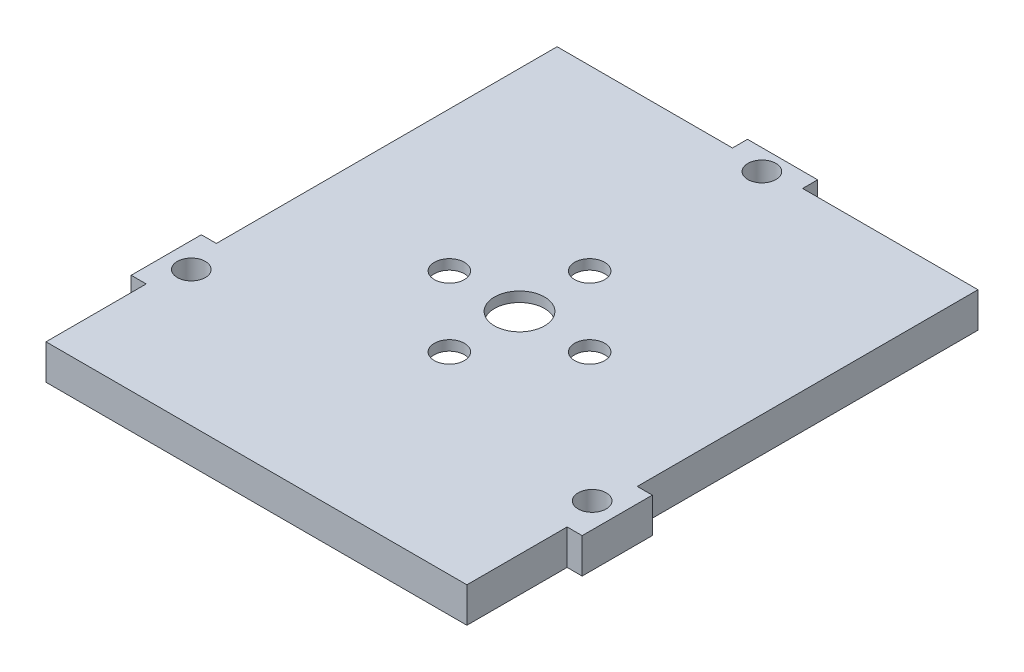
ISO-10303-21;
HEADER;
FILE_DESCRIPTION(('STEP AP214'),'2;1');
FILE_NAME('part.step','',(''),(''),'','','');
FILE_SCHEMA(('AUTOMOTIVE_DESIGN { 1 0 10303 214 1 1 1 1 }'));
ENDSEC;
DATA;
#1=APPLICATION_CONTEXT('core data for automotive mechanical design processes');
#2=APPLICATION_PROTOCOL_DEFINITION('international standard','automotive_design',2000,#1);
#3=PRODUCT_CONTEXT('',#1,'mechanical');
#4=PRODUCT('Part','Part','',(#3));
#5=PRODUCT_RELATED_PRODUCT_CATEGORY('part','',(#4));
#6=PRODUCT_DEFINITION_FORMATION('','',#4);
#7=PRODUCT_DEFINITION_CONTEXT('part definition',#1,'design');
#8=PRODUCT_DEFINITION('design','',#6,#7);
#9=PRODUCT_DEFINITION_SHAPE('','',#8);
#10=(LENGTH_UNIT() NAMED_UNIT(*) SI_UNIT(.MILLI.,.METRE.));
#11=(NAMED_UNIT(*) PLANE_ANGLE_UNIT() SI_UNIT($,.RADIAN.));
#12=(NAMED_UNIT(*) SI_UNIT($,.STERADIAN.) SOLID_ANGLE_UNIT());
#13=UNCERTAINTY_MEASURE_WITH_UNIT(LENGTH_MEASURE(1.E-05),#10,'distance_accuracy_value','');
#14=(GEOMETRIC_REPRESENTATION_CONTEXT(3) GLOBAL_UNCERTAINTY_ASSIGNED_CONTEXT((#13)) GLOBAL_UNIT_ASSIGNED_CONTEXT((#10,
#11,#12)) REPRESENTATION_CONTEXT('',''));
#15=CARTESIAN_POINT('',(0.,0.,0.));
#16=DIRECTION('',(0.,0.,1.));
#17=DIRECTION('',(1.,0.,0.));
#18=AXIS2_PLACEMENT_3D('',#15,#16,#17);
#19=CARTESIAN_POINT('',(0.,1.,-0.750000000000001));
#20=DIRECTION('',(0.,1.,0.));
#21=DIRECTION('',(0.,0.,1.));
#22=AXIS2_PLACEMENT_3D('',#19,#20,#21);
#23=CYLINDRICAL_SURFACE('',#22,2.5);
#24=CARTESIAN_POINT('',(0.,3.5,-0.750000000000001));
#25=DIRECTION('',(0.,1.,0.));
#26=DIRECTION('',(0.,0.,1.));
#27=AXIS2_PLACEMENT_3D('',#24,#25,#26);
#28=CIRCLE('',#27,2.5);
#29=CARTESIAN_POINT('',(0.,3.5,1.75));
#30=VERTEX_POINT('',#29);
#31=EDGE_CURVE('E241',#30,#30,#28,.T.);
#32=ORIENTED_EDGE('',*,*,#31,.T.);
#33=EDGE_LOOP('',(#32));
#34=FACE_BOUND('',#33,.T.);
#35=CARTESIAN_POINT('',(0.,2.5,-0.750000000000001));
#36=DIRECTION('',(0.,-1.,0.));
#37=DIRECTION('',(0.,0.,-1.));
#38=AXIS2_PLACEMENT_3D('',#35,#36,#37);
#39=CIRCLE('',#38,2.5);
#40=CARTESIAN_POINT('',(0.,2.5,-3.25));
#41=VERTEX_POINT('',#40);
#42=EDGE_CURVE('E228',#41,#41,#39,.F.);
#43=ORIENTED_EDGE('',*,*,#42,.F.);
#44=EDGE_LOOP('',(#43));
#45=FACE_BOUND('',#44,.T.);
#46=ADVANCED_FACE('F41',(#34,#45),#23,.F.);
#47=CARTESIAN_POINT('',(0.,1.,6.25));
#48=DIRECTION('',(0.,1.,0.));
#49=DIRECTION('',(0.,0.,1.));
#50=AXIS2_PLACEMENT_3D('',#47,#48,#49);
#51=CYLINDRICAL_SURFACE('',#50,1.5);
#52=CARTESIAN_POINT('',(0.,3.5,6.25));
#53=DIRECTION('',(0.,1.,0.));
#54=DIRECTION('',(0.,0.,-1.));
#55=AXIS2_PLACEMENT_3D('',#52,#53,#54);
#56=CIRCLE('',#55,1.5);
#57=CARTESIAN_POINT('',(0.,3.5,4.75));
#58=VERTEX_POINT('',#57);
#59=EDGE_CURVE('E231',#58,#58,#56,.T.);
#60=ORIENTED_EDGE('',*,*,#59,.T.);
#61=EDGE_LOOP('',(#60));
#62=FACE_BOUND('',#61,.T.);
#63=CARTESIAN_POINT('',(0.,2.5,6.25));
#64=DIRECTION('',(0.,-1.,0.));
#65=DIRECTION('',(0.,0.,-1.));
#66=AXIS2_PLACEMENT_3D('',#63,#64,#65);
#67=CIRCLE('',#66,1.5);
#68=CARTESIAN_POINT('',(0.,2.5,4.75));
#69=VERTEX_POINT('',#68);
#70=EDGE_CURVE('E225',#69,#69,#67,.F.);
#71=ORIENTED_EDGE('',*,*,#70,.F.);
#72=EDGE_LOOP('',(#71));
#73=FACE_BOUND('',#72,.T.);
#74=ADVANCED_FACE('F396',(#62,#73),#51,.F.);
#75=CARTESIAN_POINT('',(7.,1.,-0.750000000000004));
#76=DIRECTION('',(0.,1.,0.));
#77=DIRECTION('',(0.,0.,1.));
#78=AXIS2_PLACEMENT_3D('',#75,#76,#77);
#79=CYLINDRICAL_SURFACE('',#78,1.5);
#80=CARTESIAN_POINT('',(7.,3.5,-0.750000000000004));
#81=DIRECTION('',(0.,1.,0.));
#82=DIRECTION('',(0.,0.,-1.));
#83=AXIS2_PLACEMENT_3D('',#80,#81,#82);
#84=CIRCLE('',#83,1.5);
#85=CARTESIAN_POINT('',(7.,3.5,-2.25));
#86=VERTEX_POINT('',#85);
#87=EDGE_CURVE('E232',#86,#86,#84,.T.);
#88=ORIENTED_EDGE('',*,*,#87,.T.);
#89=EDGE_LOOP('',(#88));
#90=FACE_BOUND('',#89,.T.);
#91=CARTESIAN_POINT('',(7.,2.5,-0.750000000000004));
#92=DIRECTION('',(0.,-1.,0.));
#93=DIRECTION('',(0.,0.,-1.));
#94=AXIS2_PLACEMENT_3D('',#91,#92,#93);
#95=CIRCLE('',#94,1.5);
#96=CARTESIAN_POINT('',(7.,2.5,-2.25));
#97=VERTEX_POINT('',#96);
#98=EDGE_CURVE('E222',#97,#97,#95,.F.);
#99=ORIENTED_EDGE('',*,*,#98,.F.);
#100=EDGE_LOOP('',(#99));
#101=FACE_BOUND('',#100,.T.);
#102=ADVANCED_FACE('F401',(#90,#101),#79,.F.);
#103=CARTESIAN_POINT('',(0.,1.,-7.75));
#104=DIRECTION('',(0.,1.,0.));
#105=DIRECTION('',(0.,0.,1.));
#106=AXIS2_PLACEMENT_3D('',#103,#104,#105);
#107=CYLINDRICAL_SURFACE('',#106,1.5);
#108=CARTESIAN_POINT('',(0.,3.5,-7.75));
#109=DIRECTION('',(0.,1.,0.));
#110=DIRECTION('',(0.,0.,1.));
#111=AXIS2_PLACEMENT_3D('',#108,#109,#110);
#112=CIRCLE('',#111,1.5);
#113=CARTESIAN_POINT('',(0.,3.5,-6.25));
#114=VERTEX_POINT('',#113);
#115=EDGE_CURVE('E235',#114,#114,#112,.T.);
#116=ORIENTED_EDGE('',*,*,#115,.T.);
#117=EDGE_LOOP('',(#116));
#118=FACE_BOUND('',#117,.T.);
#119=CARTESIAN_POINT('',(0.,2.5,-7.75));
#120=DIRECTION('',(0.,-1.,0.));
#121=DIRECTION('',(0.,0.,-1.));
#122=AXIS2_PLACEMENT_3D('',#119,#120,#121);
#123=CIRCLE('',#122,1.5);
#124=CARTESIAN_POINT('',(0.,2.5,-9.25));
#125=VERTEX_POINT('',#124);
#126=EDGE_CURVE('E219',#125,#125,#123,.F.);
#127=ORIENTED_EDGE('',*,*,#126,.F.);
#128=EDGE_LOOP('',(#127));
#129=FACE_BOUND('',#128,.T.);
#130=ADVANCED_FACE('F406',(#118,#129),#107,.F.);
#131=CARTESIAN_POINT('',(-7.,1.,-0.750000000000002));
#132=DIRECTION('',(0.,1.,0.));
#133=DIRECTION('',(0.,0.,1.));
#134=AXIS2_PLACEMENT_3D('',#131,#132,#133);
#135=CYLINDRICAL_SURFACE('',#134,1.5);
#136=CARTESIAN_POINT('',(-7.,3.5,-0.750000000000002));
#137=DIRECTION('',(0.,1.,0.));
#138=DIRECTION('',(0.,0.,1.));
#139=AXIS2_PLACEMENT_3D('',#136,#137,#138);
#140=CIRCLE('',#139,1.5);
#141=CARTESIAN_POINT('',(-7.,3.5,0.749999999999997));
#142=VERTEX_POINT('',#141);
#143=EDGE_CURVE('E238',#142,#142,#140,.T.);
#144=ORIENTED_EDGE('',*,*,#143,.T.);
#145=EDGE_LOOP('',(#144));
#146=FACE_BOUND('',#145,.T.);
#147=CARTESIAN_POINT('',(-7.,2.5,-0.750000000000002));
#148=DIRECTION('',(0.,-1.,0.));
#149=DIRECTION('',(0.,0.,-1.));
#150=AXIS2_PLACEMENT_3D('',#147,#148,#149);
#151=CIRCLE('',#150,1.5);
#152=CARTESIAN_POINT('',(-7.,2.5,-2.25));
#153=VERTEX_POINT('',#152);
#154=EDGE_CURVE('E45',#153,#153,#151,.F.);
#155=ORIENTED_EDGE('',*,*,#154,.F.);
#156=EDGE_LOOP('',(#155));
#157=FACE_BOUND('',#156,.T.);
#158=ADVANCED_FACE('F409',(#146,#157),#135,.F.);
#159=CARTESIAN_POINT('',(0.,3.5,0.));
#160=DIRECTION('',(0.,1.,0.));
#161=DIRECTION('',(0.,0.,1.));
#162=AXIS2_PLACEMENT_3D('',#159,#160,#161);
#163=PLANE('',#162);
#164=ORIENTED_EDGE('',*,*,#143,.F.);
#165=EDGE_LOOP('',(#164));
#166=FACE_BOUND('',#165,.T.);
#167=ORIENTED_EDGE('',*,*,#115,.F.);
#168=EDGE_LOOP('',(#167));
#169=FACE_BOUND('',#168,.T.);
#170=ORIENTED_EDGE('',*,*,#87,.F.);
#171=EDGE_LOOP('',(#170));
#172=FACE_BOUND('',#171,.T.);
#173=ORIENTED_EDGE('',*,*,#59,.F.);
#174=EDGE_LOOP('',(#173));
#175=FACE_BOUND('',#174,.T.);
#176=ORIENTED_EDGE('',*,*,#31,.F.);
#177=EDGE_LOOP('',(#176));
#178=FACE_BOUND('',#177,.T.);
#179=CARTESIAN_POINT('',(-20.,3.5,12.));
#180=DIRECTION('',(0.,1.,0.));
#181=DIRECTION('',(0.,0.,1.));
#182=AXIS2_PLACEMENT_3D('',#179,#180,#181);
#183=CIRCLE('',#182,1.4);
#184=CARTESIAN_POINT('',(-20.,3.5,13.4));
#185=VERTEX_POINT('',#184);
#186=EDGE_CURVE('E247',#185,#185,#183,.T.);
#187=ORIENTED_EDGE('',*,*,#186,.F.);
#188=EDGE_LOOP('',(#187));
#189=FACE_BOUND('',#188,.T.);
#190=DIRECTION('',(0.,0.,1.));
#191=VECTOR('',#190,1.);
#192=CARTESIAN_POINT('',(21.,3.5,0.));
#193=LINE('',#192,#191);
#194=CARTESIAN_POINT('',(21.,3.5,-25.5));
#195=VERTEX_POINT('',#194);
#196=CARTESIAN_POINT('',(21.,3.5,8.5));
#197=VERTEX_POINT('',#196);
#198=EDGE_CURVE('E337',#195,#197,#193,.T.);
#199=ORIENTED_EDGE('',*,*,#198,.F.);
#200=DIRECTION('',(1.,0.,0.));
#201=VECTOR('',#200,1.);
#202=CARTESIAN_POINT('',(0.,3.5,-25.5));
#203=LINE('',#202,#201);
#204=CARTESIAN_POINT('',(3.5,3.5,-25.5));
#205=VERTEX_POINT('',#204);
#206=EDGE_CURVE('E339',#205,#195,#203,.T.);
#207=ORIENTED_EDGE('',*,*,#206,.F.);
#208=DIRECTION('',(0.,0.,1.));
#209=VECTOR('',#208,1.);
#210=CARTESIAN_POINT('',(3.5,3.5,-27.));
#211=LINE('',#210,#209);
#212=CARTESIAN_POINT('',(3.5,3.5,-27.));
#213=VERTEX_POINT('',#212);
#214=EDGE_CURVE('E266',#213,#205,#211,.T.);
#215=ORIENTED_EDGE('',*,*,#214,.F.);
#216=DIRECTION('',(1.,0.,0.));
#217=VECTOR('',#216,1.);
#218=CARTESIAN_POINT('',(3.5,3.5,-27.));
#219=LINE('',#218,#217);
#220=CARTESIAN_POINT('',(-3.5,3.5,-27.));
#221=VERTEX_POINT('',#220);
#222=EDGE_CURVE('E264',#221,#213,#219,.T.);
#223=ORIENTED_EDGE('',*,*,#222,.F.);
#224=DIRECTION('',(0.,0.,1.));
#225=VECTOR('',#224,1.);
#226=CARTESIAN_POINT('',(-3.5,3.5,-27.));
#227=LINE('',#226,#225);
#228=CARTESIAN_POINT('',(-3.5,3.5,-25.5));
#229=VERTEX_POINT('',#228);
#230=EDGE_CURVE('E273',#221,#229,#227,.T.);
#231=ORIENTED_EDGE('',*,*,#230,.T.);
#232=CARTESIAN_POINT('',(-21.,3.5,-25.5));
#233=VERTEX_POINT('',#232);
#234=EDGE_CURVE('E341',#233,#229,#203,.T.);
#235=ORIENTED_EDGE('',*,*,#234,.F.);
#236=DIRECTION('',(0.,0.,1.));
#237=VECTOR('',#236,1.);
#238=CARTESIAN_POINT('',(-21.,3.5,0.));
#239=LINE('',#238,#237);
#240=CARTESIAN_POINT('',(-21.,3.5,8.5));
#241=VERTEX_POINT('',#240);
#242=EDGE_CURVE('E344',#233,#241,#239,.T.);
#243=ORIENTED_EDGE('',*,*,#242,.T.);
#244=DIRECTION('',(1.,0.,0.));
#245=VECTOR('',#244,1.);
#246=CARTESIAN_POINT('',(-22.5,3.5,8.5));
#247=LINE('',#246,#245);
#248=CARTESIAN_POINT('',(-22.5,3.5,8.5));
#249=VERTEX_POINT('',#248);
#250=EDGE_CURVE('E330',#249,#241,#247,.T.);
#251=ORIENTED_EDGE('',*,*,#250,.F.);
#252=DIRECTION('',(0.,0.,-1.));
#253=VECTOR('',#252,1.);
#254=CARTESIAN_POINT('',(-22.5,3.5,15.5));
#255=LINE('',#254,#253);
#256=CARTESIAN_POINT('',(-22.5,3.5,15.5));
#257=VERTEX_POINT('',#256);
#258=EDGE_CURVE('E313',#257,#249,#255,.T.);
#259=ORIENTED_EDGE('',*,*,#258,.F.);
#260=DIRECTION('',(1.,0.,0.));
#261=VECTOR('',#260,1.);
#262=CARTESIAN_POINT('',(-22.5,3.5,15.5));
#263=LINE('',#262,#261);
#264=CARTESIAN_POINT('',(-21.,3.5,15.5));
#265=VERTEX_POINT('',#264);
#266=EDGE_CURVE('E333',#257,#265,#263,.T.);
#267=ORIENTED_EDGE('',*,*,#266,.T.);
#268=CARTESIAN_POINT('',(-21.,3.5,25.5));
#269=VERTEX_POINT('',#268);
#270=EDGE_CURVE('E343',#265,#269,#239,.T.);
#271=ORIENTED_EDGE('',*,*,#270,.T.);
#272=DIRECTION('',(1.,0.,0.));
#273=VECTOR('',#272,1.);
#274=CARTESIAN_POINT('',(0.,3.5,25.5));
#275=LINE('',#274,#273);
#276=CARTESIAN_POINT('',(21.,3.5,25.5));
#277=VERTEX_POINT('',#276);
#278=EDGE_CURVE('E347',#269,#277,#275,.T.);
#279=ORIENTED_EDGE('',*,*,#278,.T.);
#280=CARTESIAN_POINT('',(21.,3.5,15.5));
#281=VERTEX_POINT('',#280);
#282=EDGE_CURVE('E340',#281,#277,#193,.T.);
#283=ORIENTED_EDGE('',*,*,#282,.F.);
#284=DIRECTION('',(-1.,0.,0.));
#285=VECTOR('',#284,1.);
#286=CARTESIAN_POINT('',(22.5,3.5,15.5));
#287=LINE('',#286,#285);
#288=CARTESIAN_POINT('',(22.5,3.5,15.5));
#289=VERTEX_POINT('',#288);
#290=EDGE_CURVE('E303',#289,#281,#287,.T.);
#291=ORIENTED_EDGE('',*,*,#290,.F.);
#292=DIRECTION('',(0.,0.,1.));
#293=VECTOR('',#292,1.);
#294=CARTESIAN_POINT('',(22.5,3.5,8.5));
#295=LINE('',#294,#293);
#296=CARTESIAN_POINT('',(22.5,3.5,8.5));
#297=VERTEX_POINT('',#296);
#298=EDGE_CURVE('E286',#297,#289,#295,.T.);
#299=ORIENTED_EDGE('',*,*,#298,.F.);
#300=DIRECTION('',(-1.,0.,0.));
#301=VECTOR('',#300,1.);
#302=CARTESIAN_POINT('',(22.5,3.5,8.5));
#303=LINE('',#302,#301);
#304=EDGE_CURVE('E306',#297,#197,#303,.T.);
#305=ORIENTED_EDGE('',*,*,#304,.T.);
#306=EDGE_LOOP('',(#199,#207,#215,#223,#231,#235,#243,#251,#259,#267,#271,#279,#283,#291,#299,#305));
#307=FACE_BOUND('',#306,.T.);
#308=CARTESIAN_POINT('',(0.,3.5,-24.9375));
#309=DIRECTION('',(0.,1.,0.));
#310=DIRECTION('',(0.,0.,1.));
#311=AXIS2_PLACEMENT_3D('',#308,#309,#310);
#312=CIRCLE('',#311,1.4);
#313=CARTESIAN_POINT('',(0.,3.5,-23.5375));
#314=VERTEX_POINT('',#313);
#315=EDGE_CURVE('E246',#314,#314,#312,.T.);
#316=ORIENTED_EDGE('',*,*,#315,.F.);
#317=EDGE_LOOP('',(#316));
#318=FACE_BOUND('',#317,.T.);
#319=CARTESIAN_POINT('',(20.,3.5,12.));
#320=DIRECTION('',(0.,1.,0.));
#321=DIRECTION('',(0.,0.,1.));
#322=AXIS2_PLACEMENT_3D('',#319,#320,#321);
#323=CIRCLE('',#322,1.4);
#324=CARTESIAN_POINT('',(20.,3.5,13.4));
#325=VERTEX_POINT('',#324);
#326=EDGE_CURVE('E251',#325,#325,#323,.F.);
#327=ORIENTED_EDGE('',*,*,#326,.T.);
#328=EDGE_LOOP('',(#327));
#329=FACE_BOUND('',#328,.T.);
#330=ADVANCED_FACE('F412',(#166,#169,#172,#175,#178,#189,#307,#318,#329),#163,.T.);
#331=CARTESIAN_POINT('',(0.,0.,0.));
#332=DIRECTION('',(0.,1.,0.));
#333=DIRECTION('',(0.,0.,1.));
#334=AXIS2_PLACEMENT_3D('',#331,#332,#333);
#335=PLANE('',#334);
#336=DIRECTION('',(1.,0.,0.));
#337=VECTOR('',#336,1.);
#338=CARTESIAN_POINT('',(-12.5,0.,-13.25));
#339=LINE('',#338,#337);
#340=CARTESIAN_POINT('',(-12.5,0.,-13.25));
#341=VERTEX_POINT('',#340);
#342=CARTESIAN_POINT('',(12.5,0.,-13.25));
#343=VERTEX_POINT('',#342);
#344=EDGE_CURVE('E210',#341,#343,#339,.T.);
#345=ORIENTED_EDGE('',*,*,#344,.F.);
#346=DIRECTION('',(0.,0.,-1.));
#347=VECTOR('',#346,1.);
#348=CARTESIAN_POINT('',(-12.5,0.,11.75));
#349=LINE('',#348,#347);
#350=CARTESIAN_POINT('',(-12.5,0.,11.75));
#351=VERTEX_POINT('',#350);
#352=EDGE_CURVE('E58',#351,#341,#349,.T.);
#353=ORIENTED_EDGE('',*,*,#352,.F.);
#354=DIRECTION('',(-1.,0.,0.));
#355=VECTOR('',#354,1.);
#356=CARTESIAN_POINT('',(-12.5,0.,11.75));
#357=LINE('',#356,#355);
#358=CARTESIAN_POINT('',(12.5,0.,11.75));
#359=VERTEX_POINT('',#358);
#360=EDGE_CURVE('E201',#359,#351,#357,.T.);
#361=ORIENTED_EDGE('',*,*,#360,.F.);
#362=DIRECTION('',(0.,0.,1.));
#363=VECTOR('',#362,1.);
#364=CARTESIAN_POINT('',(12.5,0.,11.75));
#365=LINE('',#364,#363);
#366=EDGE_CURVE('E204',#343,#359,#365,.T.);
#367=ORIENTED_EDGE('',*,*,#366,.F.);
#368=EDGE_LOOP('',(#345,#353,#361,#367));
#369=FACE_BOUND('',#368,.T.);
#370=CARTESIAN_POINT('',(-20.,0.,12.));
#371=DIRECTION('',(0.,1.,0.));
#372=DIRECTION('',(0.,0.,1.));
#373=AXIS2_PLACEMENT_3D('',#370,#371,#372);
#374=CIRCLE('',#373,1.4);
#375=CARTESIAN_POINT('',(-20.,0.,13.4));
#376=VERTEX_POINT('',#375);
#377=EDGE_CURVE('E268',#376,#376,#374,.T.);
#378=ORIENTED_EDGE('',*,*,#377,.T.);
#379=EDGE_LOOP('',(#378));
#380=FACE_BOUND('',#379,.T.);
#381=CARTESIAN_POINT('',(0.,0.,-24.9375));
#382=DIRECTION('',(0.,1.,0.));
#383=DIRECTION('',(0.,0.,1.));
#384=AXIS2_PLACEMENT_3D('',#381,#382,#383);
#385=CIRCLE('',#384,1.4);
#386=CARTESIAN_POINT('',(0.,0.,-23.5375));
#387=VERTEX_POINT('',#386);
#388=EDGE_CURVE('E250',#387,#387,#385,.T.);
#389=ORIENTED_EDGE('',*,*,#388,.T.);
#390=EDGE_LOOP('',(#389));
#391=FACE_BOUND('',#390,.T.);
#392=DIRECTION('',(0.,0.,1.));
#393=VECTOR('',#392,1.);
#394=CARTESIAN_POINT('',(21.,0.,0.));
#395=LINE('',#394,#393);
#396=CARTESIAN_POINT('',(21.,0.,-25.5));
#397=VERTEX_POINT('',#396);
#398=CARTESIAN_POINT('',(21.,0.,8.5));
#399=VERTEX_POINT('',#398);
#400=EDGE_CURVE('E351',#397,#399,#395,.T.);
#401=ORIENTED_EDGE('',*,*,#400,.T.);
#402=DIRECTION('',(-1.,0.,0.));
#403=VECTOR('',#402,1.);
#404=CARTESIAN_POINT('',(22.5,0.,8.5));
#405=LINE('',#404,#403);
#406=CARTESIAN_POINT('',(22.5,0.,8.5));
#407=VERTEX_POINT('',#406);
#408=EDGE_CURVE('E293',#407,#399,#405,.T.);
#409=ORIENTED_EDGE('',*,*,#408,.F.);
#410=DIRECTION('',(0.,0.,-1.));
#411=VECTOR('',#410,1.);
#412=CARTESIAN_POINT('',(22.5,0.,8.5));
#413=LINE('',#412,#411);
#414=CARTESIAN_POINT('',(22.5,0.,15.5));
#415=VERTEX_POINT('',#414);
#416=EDGE_CURVE('E291',#415,#407,#413,.T.);
#417=ORIENTED_EDGE('',*,*,#416,.F.);
#418=DIRECTION('',(-1.,0.,0.));
#419=VECTOR('',#418,1.);
#420=CARTESIAN_POINT('',(22.5,0.,15.5));
#421=LINE('',#420,#419);
#422=CARTESIAN_POINT('',(21.,0.,15.5));
#423=VERTEX_POINT('',#422);
#424=EDGE_CURVE('E300',#415,#423,#421,.T.);
#425=ORIENTED_EDGE('',*,*,#424,.T.);
#426=CARTESIAN_POINT('',(21.,0.,25.5));
#427=VERTEX_POINT('',#426);
#428=EDGE_CURVE('E336',#423,#427,#395,.T.);
#429=ORIENTED_EDGE('',*,*,#428,.T.);
#430=DIRECTION('',(1.,0.,0.));
#431=VECTOR('',#430,1.);
#432=CARTESIAN_POINT('',(0.,0.,25.5));
#433=LINE('',#432,#431);
#434=CARTESIAN_POINT('',(-21.,0.,25.5));
#435=VERTEX_POINT('',#434);
#436=EDGE_CURVE('E361',#435,#427,#433,.T.);
#437=ORIENTED_EDGE('',*,*,#436,.F.);
#438=DIRECTION('',(0.,0.,1.));
#439=VECTOR('',#438,1.);
#440=CARTESIAN_POINT('',(-21.,0.,0.));
#441=LINE('',#440,#439);
#442=CARTESIAN_POINT('',(-21.,0.,15.5));
#443=VERTEX_POINT('',#442);
#444=EDGE_CURVE('E358',#443,#435,#441,.T.);
#445=ORIENTED_EDGE('',*,*,#444,.F.);
#446=DIRECTION('',(1.,0.,0.));
#447=VECTOR('',#446,1.);
#448=CARTESIAN_POINT('',(-22.5,0.,15.5));
#449=LINE('',#448,#447);
#450=CARTESIAN_POINT('',(-22.5,0.,15.5));
#451=VERTEX_POINT('',#450);
#452=EDGE_CURVE('E320',#451,#443,#449,.T.);
#453=ORIENTED_EDGE('',*,*,#452,.F.);
#454=DIRECTION('',(0.,0.,1.));
#455=VECTOR('',#454,1.);
#456=CARTESIAN_POINT('',(-22.5,0.,15.5));
#457=LINE('',#456,#455);
#458=CARTESIAN_POINT('',(-22.5,0.,8.5));
#459=VERTEX_POINT('',#458);
#460=EDGE_CURVE('E318',#459,#451,#457,.T.);
#461=ORIENTED_EDGE('',*,*,#460,.F.);
#462=DIRECTION('',(1.,0.,0.));
#463=VECTOR('',#462,1.);
#464=CARTESIAN_POINT('',(-22.5,0.,8.5));
#465=LINE('',#464,#463);
#466=CARTESIAN_POINT('',(-21.,0.,8.5));
#467=VERTEX_POINT('',#466);
#468=EDGE_CURVE('E327',#459,#467,#465,.T.);
#469=ORIENTED_EDGE('',*,*,#468,.T.);
#470=CARTESIAN_POINT('',(-21.,0.,-25.5));
#471=VERTEX_POINT('',#470);
#472=EDGE_CURVE('E359',#471,#467,#441,.T.);
#473=ORIENTED_EDGE('',*,*,#472,.F.);
#474=DIRECTION('',(1.,0.,0.));
#475=VECTOR('',#474,1.);
#476=CARTESIAN_POINT('',(0.,0.,-25.5));
#477=LINE('',#476,#475);
#478=CARTESIAN_POINT('',(-3.5,0.,-25.5));
#479=VERTEX_POINT('',#478);
#480=EDGE_CURVE('E355',#471,#479,#477,.T.);
#481=ORIENTED_EDGE('',*,*,#480,.T.);
#482=DIRECTION('',(0.,0.,1.));
#483=VECTOR('',#482,1.);
#484=CARTESIAN_POINT('',(-3.5,0.,-27.));
#485=LINE('',#484,#483);
#486=CARTESIAN_POINT('',(-3.5,0.,-27.));
#487=VERTEX_POINT('',#486);
#488=EDGE_CURVE('E276',#487,#479,#485,.T.);
#489=ORIENTED_EDGE('',*,*,#488,.F.);
#490=DIRECTION('',(-1.,0.,0.));
#491=VECTOR('',#490,1.);
#492=CARTESIAN_POINT('',(3.5,0.,-27.));
#493=LINE('',#492,#491);
#494=CARTESIAN_POINT('',(3.5,0.,-27.));
#495=VERTEX_POINT('',#494);
#496=EDGE_CURVE('E259',#495,#487,#493,.T.);
#497=ORIENTED_EDGE('',*,*,#496,.F.);
#498=DIRECTION('',(0.,0.,1.));
#499=VECTOR('',#498,1.);
#500=CARTESIAN_POINT('',(3.5,0.,-27.));
#501=LINE('',#500,#499);
#502=CARTESIAN_POINT('',(3.5,0.,-25.5));
#503=VERTEX_POINT('',#502);
#504=EDGE_CURVE('E279',#495,#503,#501,.T.);
#505=ORIENTED_EDGE('',*,*,#504,.T.);
#506=EDGE_CURVE('E354',#503,#397,#477,.T.);
#507=ORIENTED_EDGE('',*,*,#506,.T.);
#508=EDGE_LOOP('',(#401,#409,#417,#425,#429,#437,#445,#453,#461,#469,#473,#481,#489,#497,#505,#507));
#509=FACE_BOUND('',#508,.T.);
#510=CARTESIAN_POINT('',(20.,0.,12.));
#511=DIRECTION('',(0.,1.,0.));
#512=DIRECTION('',(0.,0.,1.));
#513=AXIS2_PLACEMENT_3D('',#510,#511,#512);
#514=CIRCLE('',#513,1.4);
#515=CARTESIAN_POINT('',(20.,0.,13.4));
#516=VERTEX_POINT('',#515);
#517=EDGE_CURVE('E372',#516,#516,#514,.F.);
#518=ORIENTED_EDGE('',*,*,#517,.F.);
#519=EDGE_LOOP('',(#518));
#520=FACE_BOUND('',#519,.T.);
#521=ADVANCED_FACE('F377',(#369,#380,#391,#509,#520),#335,.F.);
#522=CARTESIAN_POINT('',(0.,3.5,-25.5));
#523=DIRECTION('',(0.,0.,-1.));
#524=DIRECTION('',(-1.,0.,0.));
#525=AXIS2_PLACEMENT_3D('',#522,#523,#524);
#526=PLANE('',#525);
#527=DIRECTION('',(0.,-1.,0.));
#528=VECTOR('',#527,1.);
#529=CARTESIAN_POINT('',(3.5,3.5,-25.5));
#530=LINE('',#529,#528);
#531=EDGE_CURVE('E66',#205,#503,#530,.T.);
#532=ORIENTED_EDGE('',*,*,#531,.F.);
#533=ORIENTED_EDGE('',*,*,#206,.T.);
#534=DIRECTION('',(0.,-1.,0.));
#535=VECTOR('',#534,1.);
#536=CARTESIAN_POINT('',(21.,3.5,-25.5));
#537=LINE('',#536,#535);
#538=EDGE_CURVE('E11',#195,#397,#537,.T.);
#539=ORIENTED_EDGE('',*,*,#538,.T.);
#540=ORIENTED_EDGE('',*,*,#506,.F.);
#541=EDGE_LOOP('',(#532,#533,#539,#540));
#542=FACE_BOUND('',#541,.T.);
#543=ADVANCED_FACE('F435',(#542),#526,.T.);
#544=CARTESIAN_POINT('',(21.,3.5,0.));
#545=DIRECTION('',(1.,0.,0.));
#546=DIRECTION('',(0.,0.,-1.));
#547=AXIS2_PLACEMENT_3D('',#544,#545,#546);
#548=PLANE('',#547);
#549=DIRECTION('',(0.,1.,0.));
#550=VECTOR('',#549,1.);
#551=CARTESIAN_POINT('',(21.,3.5,8.5));
#552=LINE('',#551,#550);
#553=EDGE_CURVE('E282',#399,#197,#552,.T.);
#554=ORIENTED_EDGE('',*,*,#553,.F.);
#555=ORIENTED_EDGE('',*,*,#400,.F.);
#556=ORIENTED_EDGE('',*,*,#538,.F.);
#557=ORIENTED_EDGE('',*,*,#198,.T.);
#558=EDGE_LOOP('',(#554,#555,#556,#557));
#559=FACE_BOUND('',#558,.T.);
#560=ADVANCED_FACE('F440',(#559),#548,.T.);
#561=CARTESIAN_POINT('',(-21.,3.5,0.));
#562=DIRECTION('',(1.,0.,0.));
#563=DIRECTION('',(0.,0.,-1.));
#564=AXIS2_PLACEMENT_3D('',#561,#562,#563);
#565=PLANE('',#564);
#566=DIRECTION('',(0.,1.,0.));
#567=VECTOR('',#566,1.);
#568=CARTESIAN_POINT('',(-21.,3.5,15.5));
#569=LINE('',#568,#567);
#570=EDGE_CURVE('E309',#443,#265,#569,.T.);
#571=ORIENTED_EDGE('',*,*,#570,.F.);
#572=ORIENTED_EDGE('',*,*,#444,.T.);
#573=DIRECTION('',(0.,-1.,0.));
#574=VECTOR('',#573,1.);
#575=CARTESIAN_POINT('',(-21.,3.5,25.5));
#576=LINE('',#575,#574);
#577=EDGE_CURVE('E366',#269,#435,#576,.T.);
#578=ORIENTED_EDGE('',*,*,#577,.F.);
#579=ORIENTED_EDGE('',*,*,#270,.F.);
#580=EDGE_LOOP('',(#571,#572,#578,#579));
#581=FACE_BOUND('',#580,.T.);
#582=ADVANCED_FACE('F451',(#581),#565,.F.);
#583=DIRECTION('',(0.,-1.,0.));
#584=VECTOR('',#583,1.);
#585=CARTESIAN_POINT('',(-21.,3.5,8.5));
#586=LINE('',#585,#584);
#587=EDGE_CURVE('E314',#241,#467,#586,.T.);
#588=ORIENTED_EDGE('',*,*,#587,.F.);
#589=ORIENTED_EDGE('',*,*,#242,.F.);
#590=DIRECTION('',(0.,-1.,0.));
#591=VECTOR('',#590,1.);
#592=CARTESIAN_POINT('',(-21.,3.5,-25.5));
#593=LINE('',#592,#591);
#594=EDGE_CURVE('E50',#233,#471,#593,.T.);
#595=ORIENTED_EDGE('',*,*,#594,.T.);
#596=ORIENTED_EDGE('',*,*,#472,.T.);
#597=EDGE_LOOP('',(#588,#589,#595,#596));
#598=FACE_BOUND('',#597,.T.);
#599=ADVANCED_FACE('F453',(#598),#565,.F.);
#600=DIRECTION('',(0.,-1.,0.));
#601=VECTOR('',#600,1.);
#602=CARTESIAN_POINT('',(21.,3.5,15.5));
#603=LINE('',#602,#601);
#604=EDGE_CURVE('E287',#281,#423,#603,.T.);
#605=ORIENTED_EDGE('',*,*,#604,.F.);
#606=ORIENTED_EDGE('',*,*,#282,.T.);
#607=DIRECTION('',(0.,-1.,0.));
#608=VECTOR('',#607,1.);
#609=CARTESIAN_POINT('',(21.,3.5,25.5));
#610=LINE('',#609,#608);
#611=EDGE_CURVE('E350',#277,#427,#610,.T.);
#612=ORIENTED_EDGE('',*,*,#611,.T.);
#613=ORIENTED_EDGE('',*,*,#428,.F.);
#614=EDGE_LOOP('',(#605,#606,#612,#613));
#615=FACE_BOUND('',#614,.T.);
#616=ADVANCED_FACE('F43',(#615),#548,.T.);
#617=DIRECTION('',(0.,1.,0.));
#618=VECTOR('',#617,1.);
#619=CARTESIAN_POINT('',(-3.5,3.5,-25.5));
#620=LINE('',#619,#618);
#621=EDGE_CURVE('E260',#479,#229,#620,.T.);
#622=ORIENTED_EDGE('',*,*,#621,.F.);
#623=ORIENTED_EDGE('',*,*,#480,.F.);
#624=ORIENTED_EDGE('',*,*,#594,.F.);
#625=ORIENTED_EDGE('',*,*,#234,.T.);
#626=EDGE_LOOP('',(#622,#623,#624,#625));
#627=FACE_BOUND('',#626,.T.);
#628=ADVANCED_FACE('F441',(#627),#526,.T.);
#629=CARTESIAN_POINT('',(0.,3.5,25.5));
#630=DIRECTION('',(0.,0.,-1.));
#631=DIRECTION('',(-1.,0.,0.));
#632=AXIS2_PLACEMENT_3D('',#629,#630,#631);
#633=PLANE('',#632);
#634=ORIENTED_EDGE('',*,*,#436,.T.);
#635=ORIENTED_EDGE('',*,*,#611,.F.);
#636=ORIENTED_EDGE('',*,*,#278,.F.);
#637=ORIENTED_EDGE('',*,*,#577,.T.);
#638=EDGE_LOOP('',(#634,#635,#636,#637));
#639=FACE_BOUND('',#638,.T.);
#640=ADVANCED_FACE('F446',(#639),#633,.F.);
#641=CARTESIAN_POINT('',(-22.5,3.5,15.5));
#642=DIRECTION('',(0.,0.,-1.));
#643=DIRECTION('',(0.,1.,0.));
#644=AXIS2_PLACEMENT_3D('',#641,#642,#643);
#645=PLANE('',#644);
#646=ORIENTED_EDGE('',*,*,#570,.T.);
#647=ORIENTED_EDGE('',*,*,#266,.F.);
#648=DIRECTION('',(0.,1.,0.));
#649=VECTOR('',#648,1.);
#650=CARTESIAN_POINT('',(-22.5,3.5,15.5));
#651=LINE('',#650,#649);
#652=EDGE_CURVE('E310',#451,#257,#651,.T.);
#653=ORIENTED_EDGE('',*,*,#652,.F.);
#654=ORIENTED_EDGE('',*,*,#452,.T.);
#655=EDGE_LOOP('',(#646,#647,#653,#654));
#656=FACE_BOUND('',#655,.T.);
#657=ADVANCED_FACE('F449',(#656),#645,.F.);
#658=CARTESIAN_POINT('',(-22.5,3.5,8.5));
#659=DIRECTION('',(0.,0.,1.));
#660=DIRECTION('',(1.,0.,0.));
#661=AXIS2_PLACEMENT_3D('',#658,#659,#660);
#662=PLANE('',#661);
#663=ORIENTED_EDGE('',*,*,#587,.T.);
#664=ORIENTED_EDGE('',*,*,#468,.F.);
#665=DIRECTION('',(0.,-1.,0.));
#666=VECTOR('',#665,1.);
#667=CARTESIAN_POINT('',(-22.5,3.5,8.5));
#668=LINE('',#667,#666);
#669=EDGE_CURVE('E316',#249,#459,#668,.T.);
#670=ORIENTED_EDGE('',*,*,#669,.F.);
#671=ORIENTED_EDGE('',*,*,#250,.T.);
#672=EDGE_LOOP('',(#663,#664,#670,#671));
#673=FACE_BOUND('',#672,.T.);
#674=ADVANCED_FACE('F516',(#673),#662,.F.);
#675=CARTESIAN_POINT('',(-22.5,0.,0.));
#676=DIRECTION('',(1.,0.,0.));
#677=DIRECTION('',(0.,0.,-1.));
#678=AXIS2_PLACEMENT_3D('',#675,#676,#677);
#679=PLANE('',#678);
#680=ORIENTED_EDGE('',*,*,#652,.T.);
#681=ORIENTED_EDGE('',*,*,#258,.T.);
#682=ORIENTED_EDGE('',*,*,#669,.T.);
#683=ORIENTED_EDGE('',*,*,#460,.T.);
#684=EDGE_LOOP('',(#680,#681,#682,#683));
#685=FACE_BOUND('',#684,.T.);
#686=ADVANCED_FACE('F511',(#685),#679,.F.);
#687=CARTESIAN_POINT('',(22.5,3.5,8.5));
#688=DIRECTION('',(0.,0.,1.));
#689=DIRECTION('',(1.,0.,0.));
#690=AXIS2_PLACEMENT_3D('',#687,#688,#689);
#691=PLANE('',#690);
#692=ORIENTED_EDGE('',*,*,#553,.T.);
#693=ORIENTED_EDGE('',*,*,#304,.F.);
#694=DIRECTION('',(0.,1.,0.));
#695=VECTOR('',#694,1.);
#696=CARTESIAN_POINT('',(22.5,3.5,8.5));
#697=LINE('',#696,#695);
#698=EDGE_CURVE('E283',#407,#297,#697,.T.);
#699=ORIENTED_EDGE('',*,*,#698,.F.);
#700=ORIENTED_EDGE('',*,*,#408,.T.);
#701=EDGE_LOOP('',(#692,#693,#699,#700));
#702=FACE_BOUND('',#701,.T.);
#703=ADVANCED_FACE('F490',(#702),#691,.F.);
#704=CARTESIAN_POINT('',(22.5,3.5,15.5));
#705=DIRECTION('',(0.,0.,-1.));
#706=DIRECTION('',(0.,1.,0.));
#707=AXIS2_PLACEMENT_3D('',#704,#705,#706);
#708=PLANE('',#707);
#709=ORIENTED_EDGE('',*,*,#604,.T.);
#710=ORIENTED_EDGE('',*,*,#424,.F.);
#711=DIRECTION('',(0.,-1.,0.));
#712=VECTOR('',#711,1.);
#713=CARTESIAN_POINT('',(22.5,3.5,15.5));
#714=LINE('',#713,#712);
#715=EDGE_CURVE('E289',#289,#415,#714,.T.);
#716=ORIENTED_EDGE('',*,*,#715,.F.);
#717=ORIENTED_EDGE('',*,*,#290,.T.);
#718=EDGE_LOOP('',(#709,#710,#716,#717));
#719=FACE_BOUND('',#718,.T.);
#720=ADVANCED_FACE('F499',(#719),#708,.F.);
#721=CARTESIAN_POINT('',(22.5,0.,0.));
#722=DIRECTION('',(-1.,0.,0.));
#723=DIRECTION('',(0.,0.,1.));
#724=AXIS2_PLACEMENT_3D('',#721,#722,#723);
#725=PLANE('',#724);
#726=ORIENTED_EDGE('',*,*,#698,.T.);
#727=ORIENTED_EDGE('',*,*,#298,.T.);
#728=ORIENTED_EDGE('',*,*,#715,.T.);
#729=ORIENTED_EDGE('',*,*,#416,.T.);
#730=EDGE_LOOP('',(#726,#727,#728,#729));
#731=FACE_BOUND('',#730,.T.);
#732=ADVANCED_FACE('F493',(#731),#725,.F.);
#733=CARTESIAN_POINT('',(3.5,3.5,-27.));
#734=DIRECTION('',(-1.,0.,0.));
#735=DIRECTION('',(0.,-1.,0.));
#736=AXIS2_PLACEMENT_3D('',#733,#734,#735);
#737=PLANE('',#736);
#738=ORIENTED_EDGE('',*,*,#531,.T.);
#739=ORIENTED_EDGE('',*,*,#504,.F.);
#740=DIRECTION('',(0.,-1.,0.));
#741=VECTOR('',#740,1.);
#742=CARTESIAN_POINT('',(3.5,3.5,-27.));
#743=LINE('',#742,#741);
#744=EDGE_CURVE('E256',#213,#495,#743,.T.);
#745=ORIENTED_EDGE('',*,*,#744,.F.);
#746=ORIENTED_EDGE('',*,*,#214,.T.);
#747=EDGE_LOOP('',(#738,#739,#745,#746));
#748=FACE_BOUND('',#747,.T.);
#749=ADVANCED_FACE('F479',(#748),#737,.F.);
#750=CARTESIAN_POINT('',(-3.5,3.5,-27.));
#751=DIRECTION('',(1.,0.,0.));
#752=DIRECTION('',(0.,1.,0.));
#753=AXIS2_PLACEMENT_3D('',#750,#751,#752);
#754=PLANE('',#753);
#755=ORIENTED_EDGE('',*,*,#621,.T.);
#756=ORIENTED_EDGE('',*,*,#230,.F.);
#757=DIRECTION('',(0.,1.,0.));
#758=VECTOR('',#757,1.);
#759=CARTESIAN_POINT('',(-3.5,3.5,-27.));
#760=LINE('',#759,#758);
#761=EDGE_CURVE('E262',#487,#221,#760,.T.);
#762=ORIENTED_EDGE('',*,*,#761,.F.);
#763=ORIENTED_EDGE('',*,*,#488,.T.);
#764=EDGE_LOOP('',(#755,#756,#762,#763));
#765=FACE_BOUND('',#764,.T.);
#766=ADVANCED_FACE('F471',(#765),#754,.F.);
#767=CARTESIAN_POINT('',(0.,0.,-27.));
#768=DIRECTION('',(0.,0.,-1.));
#769=DIRECTION('',(-1.,0.,0.));
#770=AXIS2_PLACEMENT_3D('',#767,#768,#769);
#771=PLANE('',#770);
#772=ORIENTED_EDGE('',*,*,#744,.T.);
#773=ORIENTED_EDGE('',*,*,#496,.T.);
#774=ORIENTED_EDGE('',*,*,#761,.T.);
#775=ORIENTED_EDGE('',*,*,#222,.T.);
#776=EDGE_LOOP('',(#772,#773,#774,#775));
#777=FACE_BOUND('',#776,.T.);
#778=ADVANCED_FACE('F474',(#777),#771,.T.);
#779=CARTESIAN_POINT('',(0.,-1.5,-24.9375));
#780=DIRECTION('',(0.,1.,0.));
#781=DIRECTION('',(0.,0.,1.));
#782=AXIS2_PLACEMENT_3D('',#779,#780,#781);
#783=CYLINDRICAL_SURFACE('',#782,1.4);
#784=ORIENTED_EDGE('',*,*,#315,.T.);
#785=EDGE_LOOP('',(#784));
#786=FACE_BOUND('',#785,.T.);
#787=ORIENTED_EDGE('',*,*,#388,.F.);
#788=EDGE_LOOP('',(#787));
#789=FACE_BOUND('',#788,.T.);
#790=ADVANCED_FACE('F391',(#786,#789),#783,.F.);
#791=CARTESIAN_POINT('',(20.,-1.5,12.));
#792=DIRECTION('',(0.,1.,0.));
#793=DIRECTION('',(0.,0.,1.));
#794=AXIS2_PLACEMENT_3D('',#791,#792,#793);
#795=CYLINDRICAL_SURFACE('',#794,1.4);
#796=ORIENTED_EDGE('',*,*,#326,.F.);
#797=EDGE_LOOP('',(#796));
#798=FACE_BOUND('',#797,.T.);
#799=ORIENTED_EDGE('',*,*,#517,.T.);
#800=EDGE_LOOP('',(#799));
#801=FACE_BOUND('',#800,.T.);
#802=ADVANCED_FACE('F382',(#798,#801),#795,.F.);
#803=CARTESIAN_POINT('',(-20.,-1.5,12.));
#804=DIRECTION('',(0.,1.,0.));
#805=DIRECTION('',(0.,0.,1.));
#806=AXIS2_PLACEMENT_3D('',#803,#804,#805);
#807=CYLINDRICAL_SURFACE('',#806,1.4);
#808=ORIENTED_EDGE('',*,*,#186,.T.);
#809=EDGE_LOOP('',(#808));
#810=FACE_BOUND('',#809,.T.);
#811=ORIENTED_EDGE('',*,*,#377,.F.);
#812=EDGE_LOOP('',(#811));
#813=FACE_BOUND('',#812,.T.);
#814=ADVANCED_FACE('F380',(#810,#813),#807,.F.);
#815=CARTESIAN_POINT('',(0.,2.5,0.));
#816=DIRECTION('',(0.,-1.,0.));
#817=DIRECTION('',(0.,0.,-1.));
#818=AXIS2_PLACEMENT_3D('',#815,#816,#817);
#819=PLANE('',#818);
#820=DIRECTION('',(0.,0.,-1.));
#821=VECTOR('',#820,1.);
#822=CARTESIAN_POINT('',(-12.5,2.5,11.75));
#823=LINE('',#822,#821);
#824=CARTESIAN_POINT('',(-12.5,2.5,11.75));
#825=VERTEX_POINT('',#824);
#826=CARTESIAN_POINT('',(-12.5,2.5,-13.25));
#827=VERTEX_POINT('',#826);
#828=EDGE_CURVE('E182',#825,#827,#823,.T.);
#829=ORIENTED_EDGE('',*,*,#828,.T.);
#830=DIRECTION('',(1.,0.,0.));
#831=VECTOR('',#830,1.);
#832=CARTESIAN_POINT('',(-12.5,2.5,-13.25));
#833=LINE('',#832,#831);
#834=CARTESIAN_POINT('',(12.5,2.5,-13.25));
#835=VERTEX_POINT('',#834);
#836=EDGE_CURVE('E191',#827,#835,#833,.T.);
#837=ORIENTED_EDGE('',*,*,#836,.T.);
#838=DIRECTION('',(0.,0.,1.));
#839=VECTOR('',#838,1.);
#840=CARTESIAN_POINT('',(12.5,2.5,11.75));
#841=LINE('',#840,#839);
#842=CARTESIAN_POINT('',(12.5,2.5,11.75));
#843=VERTEX_POINT('',#842);
#844=EDGE_CURVE('E196',#835,#843,#841,.T.);
#845=ORIENTED_EDGE('',*,*,#844,.T.);
#846=DIRECTION('',(-1.,0.,0.));
#847=VECTOR('',#846,1.);
#848=CARTESIAN_POINT('',(-12.5,2.5,11.75));
#849=LINE('',#848,#847);
#850=EDGE_CURVE('E188',#843,#825,#849,.T.);
#851=ORIENTED_EDGE('',*,*,#850,.T.);
#852=EDGE_LOOP('',(#829,#837,#845,#851));
#853=FACE_BOUND('',#852,.T.);
#854=ORIENTED_EDGE('',*,*,#154,.T.);
#855=EDGE_LOOP('',(#854));
#856=FACE_BOUND('',#855,.T.);
#857=ORIENTED_EDGE('',*,*,#126,.T.);
#858=EDGE_LOOP('',(#857));
#859=FACE_BOUND('',#858,.T.);
#860=ORIENTED_EDGE('',*,*,#98,.T.);
#861=EDGE_LOOP('',(#860));
#862=FACE_BOUND('',#861,.T.);
#863=ORIENTED_EDGE('',*,*,#70,.T.);
#864=EDGE_LOOP('',(#863));
#865=FACE_BOUND('',#864,.T.);
#866=ORIENTED_EDGE('',*,*,#42,.T.);
#867=EDGE_LOOP('',(#866));
#868=FACE_BOUND('',#867,.T.);
#869=ADVANCED_FACE('F198',(#853,#856,#859,#862,#865,#868),#819,.T.);
#870=CARTESIAN_POINT('',(-12.5,2.5,11.75));
#871=DIRECTION('',(-1.,0.,0.));
#872=DIRECTION('',(0.,0.,1.));
#873=AXIS2_PLACEMENT_3D('',#870,#871,#872);
#874=PLANE('',#873);
#875=ORIENTED_EDGE('',*,*,#352,.T.);
#876=DIRECTION('',(0.,-1.,0.));
#877=VECTOR('',#876,1.);
#878=CARTESIAN_POINT('',(-12.5,2.5,-13.25));
#879=LINE('',#878,#877);
#880=EDGE_CURVE('E178',#827,#341,#879,.T.);
#881=ORIENTED_EDGE('',*,*,#880,.F.);
#882=ORIENTED_EDGE('',*,*,#828,.F.);
#883=DIRECTION('',(0.,-1.,0.));
#884=VECTOR('',#883,1.);
#885=CARTESIAN_POINT('',(-12.5,2.5,11.75));
#886=LINE('',#885,#884);
#887=EDGE_CURVE('E214',#825,#351,#886,.T.);
#888=ORIENTED_EDGE('',*,*,#887,.T.);
#889=EDGE_LOOP('',(#875,#881,#882,#888));
#890=FACE_BOUND('',#889,.T.);
#891=ADVANCED_FACE('F180',(#890),#874,.F.);
#892=CARTESIAN_POINT('',(-12.5,2.5,11.75));
#893=DIRECTION('',(0.,0.,1.));
#894=DIRECTION('',(1.,0.,0.));
#895=AXIS2_PLACEMENT_3D('',#892,#893,#894);
#896=PLANE('',#895);
#897=ORIENTED_EDGE('',*,*,#360,.T.);
#898=ORIENTED_EDGE('',*,*,#887,.F.);
#899=ORIENTED_EDGE('',*,*,#850,.F.);
#900=DIRECTION('',(0.,-1.,0.));
#901=VECTOR('',#900,1.);
#902=CARTESIAN_POINT('',(12.5,2.5,11.75));
#903=LINE('',#902,#901);
#904=EDGE_CURVE('E216',#843,#359,#903,.T.);
#905=ORIENTED_EDGE('',*,*,#904,.T.);
#906=EDGE_LOOP('',(#897,#898,#899,#905));
#907=FACE_BOUND('',#906,.T.);
#908=ADVANCED_FACE('F420',(#907),#896,.F.);
#909=CARTESIAN_POINT('',(12.5,2.5,11.75));
#910=DIRECTION('',(1.,0.,0.));
#911=DIRECTION('',(0.,0.,-1.));
#912=AXIS2_PLACEMENT_3D('',#909,#910,#911);
#913=PLANE('',#912);
#914=ORIENTED_EDGE('',*,*,#366,.T.);
#915=ORIENTED_EDGE('',*,*,#904,.F.);
#916=ORIENTED_EDGE('',*,*,#844,.F.);
#917=DIRECTION('',(0.,-1.,0.));
#918=VECTOR('',#917,1.);
#919=CARTESIAN_POINT('',(12.5,2.5,-13.25));
#920=LINE('',#919,#918);
#921=EDGE_CURVE('E187',#835,#343,#920,.T.);
#922=ORIENTED_EDGE('',*,*,#921,.T.);
#923=EDGE_LOOP('',(#914,#915,#916,#922));
#924=FACE_BOUND('',#923,.T.);
#925=ADVANCED_FACE('F423',(#924),#913,.F.);
#926=CARTESIAN_POINT('',(-12.5,2.5,-13.25));
#927=DIRECTION('',(0.,0.,-1.));
#928=DIRECTION('',(-1.,0.,0.));
#929=AXIS2_PLACEMENT_3D('',#926,#927,#928);
#930=PLANE('',#929);
#931=ORIENTED_EDGE('',*,*,#344,.T.);
#932=ORIENTED_EDGE('',*,*,#921,.F.);
#933=ORIENTED_EDGE('',*,*,#836,.F.);
#934=ORIENTED_EDGE('',*,*,#880,.T.);
#935=EDGE_LOOP('',(#931,#932,#933,#934));
#936=FACE_BOUND('',#935,.T.);
#937=ADVANCED_FACE('F192',(#936),#930,.F.);
#938=CLOSED_SHELL('',(#46,#74,#102,#130,#158,#330,#521,#543,#560,#582,#599,#616,#628,#640,#657,
#674,#686,#703,#720,#732,#749,#766,#778,#790,#802,#814,#869,#891,#908,#925,#937));
#939=MANIFOLD_SOLID_BREP('B2',#938);
#940=ADVANCED_BREP_SHAPE_REPRESENTATION('',(#18,#939),#14);
#941=SHAPE_DEFINITION_REPRESENTATION(#9,#940);
ENDSEC;
END-ISO-10303-21;
